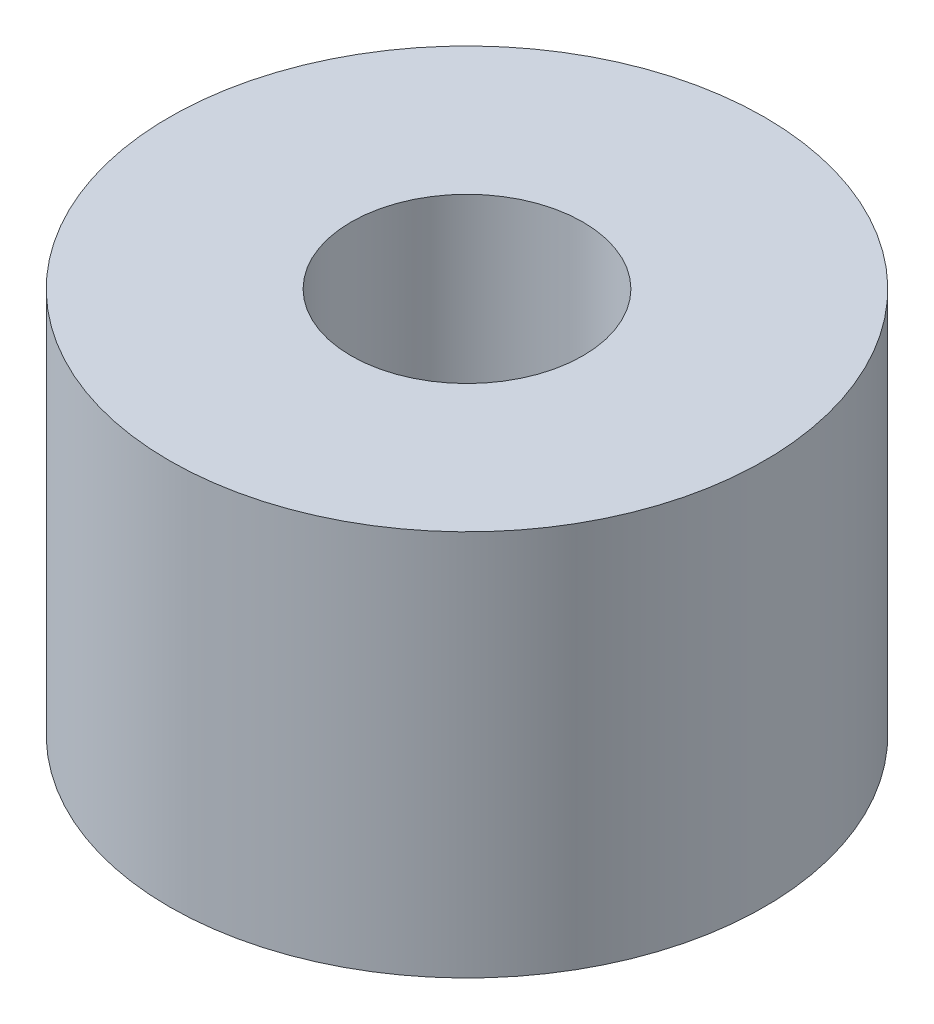
ISO-10303-21;
HEADER;
FILE_DESCRIPTION(('STEP AP214'),'2;1');
FILE_NAME('part.step','',(''),(''),'','','');
FILE_SCHEMA(('AUTOMOTIVE_DESIGN { 1 0 10303 214 1 1 1 1 }'));
ENDSEC;
DATA;
#1=APPLICATION_CONTEXT('core data for automotive mechanical design processes');
#2=APPLICATION_PROTOCOL_DEFINITION('international standard','automotive_design',2000,#1);
#3=PRODUCT_CONTEXT('',#1,'mechanical');
#4=PRODUCT('Part','Part','',(#3));
#5=PRODUCT_RELATED_PRODUCT_CATEGORY('part','',(#4));
#6=PRODUCT_DEFINITION_FORMATION('','',#4);
#7=PRODUCT_DEFINITION_CONTEXT('part definition',#1,'design');
#8=PRODUCT_DEFINITION('design','',#6,#7);
#9=PRODUCT_DEFINITION_SHAPE('','',#8);
#10=(LENGTH_UNIT() NAMED_UNIT(*) SI_UNIT(.MILLI.,.METRE.));
#11=(NAMED_UNIT(*) PLANE_ANGLE_UNIT() SI_UNIT($,.RADIAN.));
#12=(NAMED_UNIT(*) SI_UNIT($,.STERADIAN.) SOLID_ANGLE_UNIT());
#13=UNCERTAINTY_MEASURE_WITH_UNIT(LENGTH_MEASURE(1.E-05),#10,'distance_accuracy_value','');
#14=(GEOMETRIC_REPRESENTATION_CONTEXT(3) GLOBAL_UNCERTAINTY_ASSIGNED_CONTEXT((#13)) GLOBAL_UNIT_ASSIGNED_CONTEXT((#10,
#11,#12)) REPRESENTATION_CONTEXT('',''));
#15=CARTESIAN_POINT('',(0.,0.,0.));
#16=DIRECTION('',(0.,0.,1.));
#17=DIRECTION('',(1.,0.,0.));
#18=AXIS2_PLACEMENT_3D('',#15,#16,#17);
#19=CARTESIAN_POINT('',(0.,10.,0.));
#20=DIRECTION('',(0.,-1.,0.));
#21=DIRECTION('',(0.,0.,-1.));
#22=AXIS2_PLACEMENT_3D('',#19,#20,#21);
#23=CYLINDRICAL_SURFACE('',#22,7.7);
#24=CARTESIAN_POINT('',(0.,10.,0.));
#25=DIRECTION('',(0.,1.,0.));
#26=DIRECTION('',(0.,0.,1.));
#27=AXIS2_PLACEMENT_3D('',#24,#25,#26);
#28=CIRCLE('',#27,7.7);
#29=CARTESIAN_POINT('',(0.,10.,7.7));
#30=VERTEX_POINT('',#29);
#31=EDGE_CURVE('E10',#30,#30,#28,.T.);
#32=ORIENTED_EDGE('',*,*,#31,.F.);
#33=EDGE_LOOP('',(#32));
#34=FACE_BOUND('',#33,.T.);
#35=CARTESIAN_POINT('',(0.,0.,0.));
#36=DIRECTION('',(0.,1.,0.));
#37=DIRECTION('',(0.,0.,1.));
#38=AXIS2_PLACEMENT_3D('',#35,#36,#37);
#39=CIRCLE('',#38,7.7);
#40=CARTESIAN_POINT('',(0.,0.,7.7));
#41=VERTEX_POINT('',#40);
#42=EDGE_CURVE('E42',#41,#41,#39,.T.);
#43=ORIENTED_EDGE('',*,*,#42,.T.);
#44=EDGE_LOOP('',(#43));
#45=FACE_BOUND('',#44,.T.);
#46=ADVANCED_FACE('F39',(#34,#45),#23,.T.);
#47=CARTESIAN_POINT('',(0.,10.,0.));
#48=DIRECTION('',(0.,1.,0.));
#49=DIRECTION('',(0.,0.,1.));
#50=AXIS2_PLACEMENT_3D('',#47,#48,#49);
#51=PLANE('',#50);
#52=CARTESIAN_POINT('',(0.,10.,0.));
#53=DIRECTION('',(0.,1.,0.));
#54=DIRECTION('',(0.,0.,1.));
#55=AXIS2_PLACEMENT_3D('',#52,#53,#54);
#56=CIRCLE('',#55,3.);
#57=CARTESIAN_POINT('',(0.,10.,3.));
#58=VERTEX_POINT('',#57);
#59=EDGE_CURVE('E53',#58,#58,#56,.T.);
#60=ORIENTED_EDGE('',*,*,#59,.F.);
#61=EDGE_LOOP('',(#60));
#62=FACE_BOUND('',#61,.T.);
#63=ORIENTED_EDGE('',*,*,#31,.T.);
#64=EDGE_LOOP('',(#63));
#65=FACE_BOUND('',#64,.T.);
#66=ADVANCED_FACE('F70',(#62,#65),#51,.T.);
#67=CARTESIAN_POINT('',(0.,0.,0.));
#68=DIRECTION('',(0.,1.,0.));
#69=DIRECTION('',(0.,0.,1.));
#70=AXIS2_PLACEMENT_3D('',#67,#68,#69);
#71=PLANE('',#70);
#72=ORIENTED_EDGE('',*,*,#42,.F.);
#73=EDGE_LOOP('',(#72));
#74=FACE_BOUND('',#73,.T.);
#75=ADVANCED_FACE('F66',(#74),#71,.F.);
#76=CARTESIAN_POINT('',(0.,5.,0.));
#77=DIRECTION('',(0.,1.,0.));
#78=DIRECTION('',(0.,0.,1.));
#79=AXIS2_PLACEMENT_3D('',#76,#77,#78);
#80=CYLINDRICAL_SURFACE('',#79,3.);
#81=CARTESIAN_POINT('',(0.,5.,0.));
#82=DIRECTION('',(0.,1.,0.));
#83=DIRECTION('',(0.,0.,1.));
#84=AXIS2_PLACEMENT_3D('',#81,#82,#83);
#85=CIRCLE('',#84,3.);
#86=CARTESIAN_POINT('',(0.,5.,3.));
#87=VERTEX_POINT('',#86);
#88=EDGE_CURVE('E51',#87,#87,#85,.T.);
#89=ORIENTED_EDGE('',*,*,#88,.F.);
#90=EDGE_LOOP('',(#89));
#91=FACE_BOUND('',#90,.T.);
#92=ORIENTED_EDGE('',*,*,#59,.T.);
#93=EDGE_LOOP('',(#92));
#94=FACE_BOUND('',#93,.T.);
#95=ADVANCED_FACE('F63',(#91,#94),#80,.F.);
#96=CARTESIAN_POINT('',(0.,5.,0.));
#97=DIRECTION('',(0.,1.,0.));
#98=DIRECTION('',(0.,0.,1.));
#99=AXIS2_PLACEMENT_3D('',#96,#97,#98);
#100=PLANE('',#99);
#101=ORIENTED_EDGE('',*,*,#88,.T.);
#102=EDGE_LOOP('',(#101));
#103=FACE_BOUND('',#102,.T.);
#104=ADVANCED_FACE('F61',(#103),#100,.T.);
#105=CLOSED_SHELL('',(#46,#66,#75,#95,#104));
#106=MANIFOLD_SOLID_BREP('B2',#105);
#107=ADVANCED_BREP_SHAPE_REPRESENTATION('',(#18,#106),#14);
#108=SHAPE_DEFINITION_REPRESENTATION(#9,#107);
ENDSEC;
END-ISO-10303-21;
